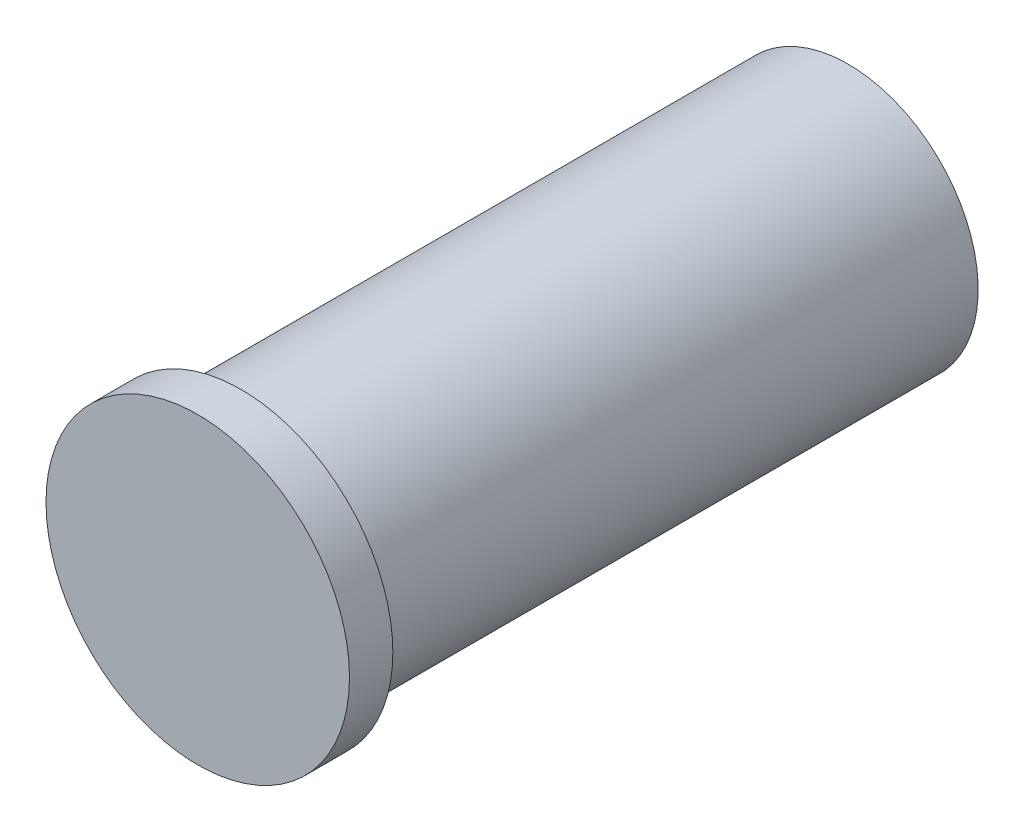
ISO-10303-21;
HEADER;
FILE_DESCRIPTION(('STEP AP214'),'2;1');
FILE_NAME('part.step','',(''),(''),'','','');
FILE_SCHEMA(('AUTOMOTIVE_DESIGN { 1 0 10303 214 1 1 1 1 }'));
ENDSEC;
DATA;
#1=APPLICATION_CONTEXT('core data for automotive mechanical design processes');
#2=APPLICATION_PROTOCOL_DEFINITION('international standard','automotive_design',2000,#1);
#3=PRODUCT_CONTEXT('',#1,'mechanical');
#4=PRODUCT('Part','Part','',(#3));
#5=PRODUCT_RELATED_PRODUCT_CATEGORY('part','',(#4));
#6=PRODUCT_DEFINITION_FORMATION('','',#4);
#7=PRODUCT_DEFINITION_CONTEXT('part definition',#1,'design');
#8=PRODUCT_DEFINITION('design','',#6,#7);
#9=PRODUCT_DEFINITION_SHAPE('','',#8);
#10=(LENGTH_UNIT() NAMED_UNIT(*) SI_UNIT(.MILLI.,.METRE.));
#11=(NAMED_UNIT(*) PLANE_ANGLE_UNIT() SI_UNIT($,.RADIAN.));
#12=(NAMED_UNIT(*) SI_UNIT($,.STERADIAN.) SOLID_ANGLE_UNIT());
#13=UNCERTAINTY_MEASURE_WITH_UNIT(LENGTH_MEASURE(1.E-05),#10,'distance_accuracy_value','');
#14=(GEOMETRIC_REPRESENTATION_CONTEXT(3) GLOBAL_UNCERTAINTY_ASSIGNED_CONTEXT((#13)) GLOBAL_UNIT_ASSIGNED_CONTEXT((#10,
#11,#12)) REPRESENTATION_CONTEXT('',''));
#15=CARTESIAN_POINT('',(0.,0.,0.));
#16=DIRECTION('',(0.,0.,1.));
#17=DIRECTION('',(1.,0.,0.));
#18=AXIS2_PLACEMENT_3D('',#15,#16,#17);
#19=CARTESIAN_POINT('',(0.,0.,2.));
#20=DIRECTION('',(0.,0.,-1.));
#21=DIRECTION('',(-1.,0.,0.));
#22=AXIS2_PLACEMENT_3D('',#19,#20,#21);
#23=CYLINDRICAL_SURFACE('',#22,1.5);
#24=CARTESIAN_POINT('',(0.,0.,2.));
#25=DIRECTION('',(0.,0.,1.));
#26=DIRECTION('',(1.,0.,0.));
#27=AXIS2_PLACEMENT_3D('',#24,#25,#26);
#28=CIRCLE('',#27,1.5);
#29=CARTESIAN_POINT('',(1.5,0.,2.));
#30=VERTEX_POINT('',#29);
#31=EDGE_CURVE('E10',#30,#30,#28,.T.);
#32=ORIENTED_EDGE('',*,*,#31,.F.);
#33=EDGE_LOOP('',(#32));
#34=FACE_BOUND('',#33,.T.);
#35=CARTESIAN_POINT('',(0.,0.,-5.));
#36=DIRECTION('',(0.,0.,-1.));
#37=DIRECTION('',(-1.,0.,0.));
#38=AXIS2_PLACEMENT_3D('',#35,#36,#37);
#39=CIRCLE('',#38,1.5);
#40=CARTESIAN_POINT('',(-1.5,0.,-5.));
#41=VERTEX_POINT('',#40);
#42=EDGE_CURVE('E59',#41,#41,#39,.T.);
#43=ORIENTED_EDGE('',*,*,#42,.F.);
#44=EDGE_LOOP('',(#43));
#45=FACE_BOUND('',#44,.T.);
#46=ADVANCED_FACE('F41',(#34,#45),#23,.T.);
#47=CARTESIAN_POINT('',(0.,0.,2.5));
#48=DIRECTION('',(0.,0.,-1.));
#49=DIRECTION('',(-1.,0.,0.));
#50=AXIS2_PLACEMENT_3D('',#47,#48,#49);
#51=CYLINDRICAL_SURFACE('',#50,1.75);
#52=CARTESIAN_POINT('',(0.,0.,2.5));
#53=DIRECTION('',(0.,0.,1.));
#54=DIRECTION('',(1.,0.,0.));
#55=AXIS2_PLACEMENT_3D('',#52,#53,#54);
#56=CIRCLE('',#55,1.75);
#57=CARTESIAN_POINT('',(1.75,0.,2.5));
#58=VERTEX_POINT('',#57);
#59=EDGE_CURVE('E48',#58,#58,#56,.T.);
#60=ORIENTED_EDGE('',*,*,#59,.F.);
#61=EDGE_LOOP('',(#60));
#62=FACE_BOUND('',#61,.T.);
#63=CARTESIAN_POINT('',(0.,0.,2.));
#64=DIRECTION('',(0.,0.,1.));
#65=DIRECTION('',(1.,0.,0.));
#66=AXIS2_PLACEMENT_3D('',#63,#64,#65);
#67=CIRCLE('',#66,1.75);
#68=CARTESIAN_POINT('',(1.75,0.,2.));
#69=VERTEX_POINT('',#68);
#70=EDGE_CURVE('E53',#69,#69,#67,.T.);
#71=ORIENTED_EDGE('',*,*,#70,.T.);
#72=EDGE_LOOP('',(#71));
#73=FACE_BOUND('',#72,.T.);
#74=ADVANCED_FACE('F68',(#62,#73),#51,.T.);
#75=CARTESIAN_POINT('',(0.,0.,2.5));
#76=DIRECTION('',(0.,0.,1.));
#77=DIRECTION('',(1.,0.,0.));
#78=AXIS2_PLACEMENT_3D('',#75,#76,#77);
#79=PLANE('',#78);
#80=ORIENTED_EDGE('',*,*,#59,.T.);
#81=EDGE_LOOP('',(#80));
#82=FACE_BOUND('',#81,.T.);
#83=ADVANCED_FACE('F75',(#82),#79,.T.);
#84=CARTESIAN_POINT('',(0.,0.,2.));
#85=DIRECTION('',(0.,0.,1.));
#86=DIRECTION('',(1.,0.,0.));
#87=AXIS2_PLACEMENT_3D('',#84,#85,#86);
#88=PLANE('',#87);
#89=ORIENTED_EDGE('',*,*,#31,.T.);
#90=EDGE_LOOP('',(#89));
#91=FACE_BOUND('',#90,.T.);
#92=ORIENTED_EDGE('',*,*,#70,.F.);
#93=EDGE_LOOP('',(#92));
#94=FACE_BOUND('',#93,.T.);
#95=ADVANCED_FACE('F80',(#91,#94),#88,.F.);
#96=CARTESIAN_POINT('',(0.,0.,-5.));
#97=DIRECTION('',(0.,0.,-1.));
#98=DIRECTION('',(-1.,0.,0.));
#99=AXIS2_PLACEMENT_3D('',#96,#97,#98);
#100=PLANE('',#99);
#101=ORIENTED_EDGE('',*,*,#42,.T.);
#102=EDGE_LOOP('',(#101));
#103=FACE_BOUND('',#102,.T.);
#104=ADVANCED_FACE('F65',(#103),#100,.T.);
#105=CLOSED_SHELL('',(#46,#74,#83,#95,#104));
#106=MANIFOLD_SOLID_BREP('B2',#105);
#107=ADVANCED_BREP_SHAPE_REPRESENTATION('',(#18,#106),#14);
#108=SHAPE_DEFINITION_REPRESENTATION(#9,#107);
ENDSEC;
END-ISO-10303-21;
